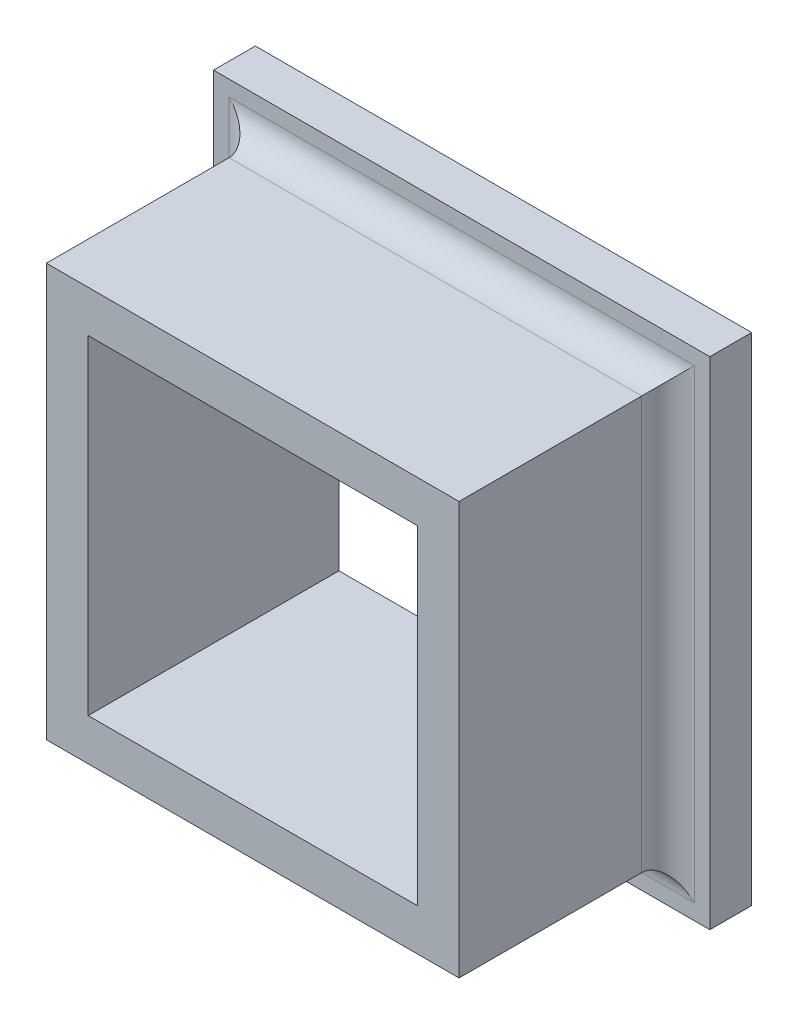
ISO-10303-21;
HEADER;
FILE_DESCRIPTION(('STEP AP214'),'2;1');
FILE_NAME('part.step','',(''),(''),'','','');
FILE_SCHEMA(('AUTOMOTIVE_DESIGN { 1 0 10303 214 1 1 1 1 }'));
ENDSEC;
DATA;
#1=APPLICATION_CONTEXT('core data for automotive mechanical design processes');
#2=APPLICATION_PROTOCOL_DEFINITION('international standard','automotive_design',2000,#1);
#3=PRODUCT_CONTEXT('',#1,'mechanical');
#4=PRODUCT('Part','Part','',(#3));
#5=PRODUCT_RELATED_PRODUCT_CATEGORY('part','',(#4));
#6=PRODUCT_DEFINITION_FORMATION('','',#4);
#7=PRODUCT_DEFINITION_CONTEXT('part definition',#1,'design');
#8=PRODUCT_DEFINITION('design','',#6,#7);
#9=PRODUCT_DEFINITION_SHAPE('','',#8);
#10=(LENGTH_UNIT() NAMED_UNIT(*) SI_UNIT(.MILLI.,.METRE.));
#11=(NAMED_UNIT(*) PLANE_ANGLE_UNIT() SI_UNIT($,.RADIAN.));
#12=(NAMED_UNIT(*) SI_UNIT($,.STERADIAN.) SOLID_ANGLE_UNIT());
#13=UNCERTAINTY_MEASURE_WITH_UNIT(LENGTH_MEASURE(1.E-05),#10,'distance_accuracy_value','');
#14=(GEOMETRIC_REPRESENTATION_CONTEXT(3) GLOBAL_UNCERTAINTY_ASSIGNED_CONTEXT((#13)) GLOBAL_UNIT_ASSIGNED_CONTEXT((#10,
#11,#12)) REPRESENTATION_CONTEXT('',''));
#15=CARTESIAN_POINT('',(0.,0.,0.));
#16=DIRECTION('',(0.,0.,1.));
#17=DIRECTION('',(1.,0.,0.));
#18=AXIS2_PLACEMENT_3D('',#15,#16,#17);
#19=CARTESIAN_POINT('',(0.,7.55340909090909,9.525));
#20=DIRECTION('',(0.,1.,0.));
#21=DIRECTION('',(0.,0.,1.));
#22=AXIS2_PLACEMENT_3D('',#19,#20,#21);
#23=PLANE('',#22);
#24=DIRECTION('',(0.,0.,-1.));
#25=VECTOR('',#24,1.);
#26=CARTESIAN_POINT('',(7.68254132231405,7.55340909090909,9.525));
#27=LINE('',#26,#25);
#28=CARTESIAN_POINT('',(7.68254132231405,7.55340909090909,9.525));
#29=VERTEX_POINT('',#28);
#30=CARTESIAN_POINT('',(7.68254132231405,7.55340909090909,2.5875));
#31=VERTEX_POINT('',#30);
#32=EDGE_CURVE('E218',#29,#31,#27,.T.);
#33=ORIENTED_EDGE('',*,*,#32,.T.);
#34=DIRECTION('',(-1.,0.,0.));
#35=VECTOR('',#34,1.);
#36=CARTESIAN_POINT('',(0.,7.55340909090909,2.5875));
#37=LINE('',#36,#35);
#38=CARTESIAN_POINT('',(-7.99245867768595,7.55340909090909,2.5875));
#39=VERTEX_POINT('',#38);
#40=EDGE_CURVE('E57',#31,#39,#37,.T.);
#41=ORIENTED_EDGE('',*,*,#40,.T.);
#42=DIRECTION('',(0.,0.,-1.));
#43=VECTOR('',#42,1.);
#44=CARTESIAN_POINT('',(-7.99245867768595,7.55340909090909,9.525));
#45=LINE('',#44,#43);
#46=CARTESIAN_POINT('',(-7.99245867768595,7.55340909090909,9.525));
#47=VERTEX_POINT('',#46);
#48=EDGE_CURVE('E225',#47,#39,#45,.T.);
#49=ORIENTED_EDGE('',*,*,#48,.F.);
#50=DIRECTION('',(1.,0.,0.));
#51=VECTOR('',#50,1.);
#52=CARTESIAN_POINT('',(0.,7.55340909090909,9.525));
#53=LINE('',#52,#51);
#54=EDGE_CURVE('E206',#47,#29,#53,.T.);
#55=ORIENTED_EDGE('',*,*,#54,.T.);
#56=EDGE_LOOP('',(#33,#41,#49,#55));
#57=FACE_BOUND('',#56,.T.);
#58=ADVANCED_FACE('F34',(#57),#23,.T.);
#59=CARTESIAN_POINT('',(-7.99245867768595,0.,9.525));
#60=DIRECTION('',(1.,0.,0.));
#61=DIRECTION('',(0.,0.,-1.));
#62=AXIS2_PLACEMENT_3D('',#59,#60,#61);
#63=PLANE('',#62);
#64=ORIENTED_EDGE('',*,*,#48,.T.);
#65=DIRECTION('',(0.,1.,0.));
#66=VECTOR('',#65,1.);
#67=CARTESIAN_POINT('',(-7.99245867768595,-8.12159090909091,2.5875));
#68=LINE('',#67,#66);
#69=CARTESIAN_POINT('',(-7.99245867768595,-8.12159090909091,2.5875));
#70=VERTEX_POINT('',#69);
#71=EDGE_CURVE('E11',#39,#70,#68,.F.);
#72=ORIENTED_EDGE('',*,*,#71,.T.);
#73=DIRECTION('',(0.,0.,-1.));
#74=VECTOR('',#73,1.);
#75=CARTESIAN_POINT('',(-7.99245867768595,-8.12159090909091,9.525));
#76=LINE('',#75,#74);
#77=CARTESIAN_POINT('',(-7.99245867768595,-8.12159090909091,9.525));
#78=VERTEX_POINT('',#77);
#79=EDGE_CURVE('E223',#78,#70,#76,.T.);
#80=ORIENTED_EDGE('',*,*,#79,.F.);
#81=DIRECTION('',(0.,-1.,0.));
#82=VECTOR('',#81,1.);
#83=CARTESIAN_POINT('',(-7.99245867768595,0.,9.525));
#84=LINE('',#83,#82);
#85=EDGE_CURVE('E209',#47,#78,#84,.T.);
#86=ORIENTED_EDGE('',*,*,#85,.F.);
#87=EDGE_LOOP('',(#64,#72,#80,#86));
#88=FACE_BOUND('',#87,.T.);
#89=ADVANCED_FACE('F273',(#88),#63,.F.);
#90=CARTESIAN_POINT('',(0.,-8.12159090909091,9.525));
#91=DIRECTION('',(0.,1.,0.));
#92=DIRECTION('',(0.,0.,1.));
#93=AXIS2_PLACEMENT_3D('',#90,#91,#92);
#94=PLANE('',#93);
#95=ORIENTED_EDGE('',*,*,#79,.T.);
#96=DIRECTION('',(-1.,0.,0.));
#97=VECTOR('',#96,1.);
#98=CARTESIAN_POINT('',(7.68254132231405,-8.12159090909091,2.5875));
#99=LINE('',#98,#97);
#100=CARTESIAN_POINT('',(7.68254132231405,-8.12159090909091,2.5875));
#101=VERTEX_POINT('',#100);
#102=EDGE_CURVE('E43',#70,#101,#99,.F.);
#103=ORIENTED_EDGE('',*,*,#102,.T.);
#104=DIRECTION('',(0.,0.,-1.));
#105=VECTOR('',#104,1.);
#106=CARTESIAN_POINT('',(7.68254132231405,-8.12159090909091,9.525));
#107=LINE('',#106,#105);
#108=CARTESIAN_POINT('',(7.68254132231405,-8.12159090909091,9.525));
#109=VERTEX_POINT('',#108);
#110=EDGE_CURVE('E220',#109,#101,#107,.T.);
#111=ORIENTED_EDGE('',*,*,#110,.F.);
#112=DIRECTION('',(1.,0.,0.));
#113=VECTOR('',#112,1.);
#114=CARTESIAN_POINT('',(0.,-8.12159090909091,9.525));
#115=LINE('',#114,#113);
#116=EDGE_CURVE('E212',#78,#109,#115,.T.);
#117=ORIENTED_EDGE('',*,*,#116,.F.);
#118=EDGE_LOOP('',(#95,#103,#111,#117));
#119=FACE_BOUND('',#118,.T.);
#120=ADVANCED_FACE('F275',(#119),#94,.F.);
#121=CARTESIAN_POINT('',(0.,5.96590909090909,9.525));
#122=DIRECTION('',(0.,1.,0.));
#123=DIRECTION('',(0.,0.,1.));
#124=AXIS2_PLACEMENT_3D('',#121,#122,#123);
#125=PLANE('',#124);
#126=DIRECTION('',(0.,0.,-1.));
#127=VECTOR('',#126,1.);
#128=CARTESIAN_POINT('',(-6.40495867768595,5.96590909090909,9.525));
#129=LINE('',#128,#127);
#130=CARTESIAN_POINT('',(-6.40495867768595,5.96590909090909,9.525));
#131=VERTEX_POINT('',#130);
#132=CARTESIAN_POINT('',(-6.40495867768595,5.96590909090909,0.));
#133=VERTEX_POINT('',#132);
#134=EDGE_CURVE('E217',#131,#133,#129,.T.);
#135=ORIENTED_EDGE('',*,*,#134,.T.);
#136=DIRECTION('',(1.,0.,0.));
#137=VECTOR('',#136,1.);
#138=CARTESIAN_POINT('',(-6.40495867768595,5.96590909090909,0.));
#139=LINE('',#138,#137);
#140=CARTESIAN_POINT('',(6.09504132231405,5.96590909090909,0.));
#141=VERTEX_POINT('',#140);
#142=EDGE_CURVE('E157',#133,#141,#139,.T.);
#143=ORIENTED_EDGE('',*,*,#142,.T.);
#144=DIRECTION('',(0.,0.,-1.));
#145=VECTOR('',#144,1.);
#146=CARTESIAN_POINT('',(6.09504132231405,5.96590909090909,9.525));
#147=LINE('',#146,#145);
#148=CARTESIAN_POINT('',(6.09504132231405,5.96590909090909,9.525));
#149=VERTEX_POINT('',#148);
#150=EDGE_CURVE('E147',#149,#141,#147,.T.);
#151=ORIENTED_EDGE('',*,*,#150,.F.);
#152=DIRECTION('',(1.,0.,0.));
#153=VECTOR('',#152,1.);
#154=CARTESIAN_POINT('',(0.,5.96590909090909,9.525));
#155=LINE('',#154,#153);
#156=EDGE_CURVE('E191',#131,#149,#155,.T.);
#157=ORIENTED_EDGE('',*,*,#156,.F.);
#158=EDGE_LOOP('',(#135,#143,#151,#157));
#159=FACE_BOUND('',#158,.T.);
#160=ADVANCED_FACE('F258',(#159),#125,.F.);
#161=CARTESIAN_POINT('',(6.09504132231405,0.,9.525));
#162=DIRECTION('',(1.,0.,0.));
#163=DIRECTION('',(0.,1.,0.));
#164=AXIS2_PLACEMENT_3D('',#161,#162,#163);
#165=PLANE('',#164);
#166=ORIENTED_EDGE('',*,*,#150,.T.);
#167=DIRECTION('',(0.,-1.,0.));
#168=VECTOR('',#167,1.);
#169=CARTESIAN_POINT('',(6.09504132231405,5.96590909090909,0.));
#170=LINE('',#169,#168);
#171=CARTESIAN_POINT('',(6.09504132231405,-6.53409090909091,0.));
#172=VERTEX_POINT('',#171);
#173=EDGE_CURVE('E151',#141,#172,#170,.T.);
#174=ORIENTED_EDGE('',*,*,#173,.T.);
#175=DIRECTION('',(0.,0.,-1.));
#176=VECTOR('',#175,1.);
#177=CARTESIAN_POINT('',(6.09504132231405,-6.53409090909091,9.525));
#178=LINE('',#177,#176);
#179=CARTESIAN_POINT('',(6.09504132231405,-6.53409090909091,9.525));
#180=VERTEX_POINT('',#179);
#181=EDGE_CURVE('E138',#180,#172,#178,.T.);
#182=ORIENTED_EDGE('',*,*,#181,.F.);
#183=DIRECTION('',(0.,-1.,0.));
#184=VECTOR('',#183,1.);
#185=CARTESIAN_POINT('',(6.09504132231405,0.,9.525));
#186=LINE('',#185,#184);
#187=EDGE_CURVE('E200',#149,#180,#186,.T.);
#188=ORIENTED_EDGE('',*,*,#187,.F.);
#189=EDGE_LOOP('',(#166,#174,#182,#188));
#190=FACE_BOUND('',#189,.T.);
#191=ADVANCED_FACE('F152',(#190),#165,.F.);
#192=CARTESIAN_POINT('',(0.,-6.53409090909091,9.525));
#193=DIRECTION('',(0.,1.,0.));
#194=DIRECTION('',(0.,0.,1.));
#195=AXIS2_PLACEMENT_3D('',#192,#193,#194);
#196=PLANE('',#195);
#197=ORIENTED_EDGE('',*,*,#181,.T.);
#198=DIRECTION('',(1.,0.,0.));
#199=VECTOR('',#198,1.);
#200=CARTESIAN_POINT('',(-6.40495867768595,-6.53409090909091,0.));
#201=LINE('',#200,#199);
#202=CARTESIAN_POINT('',(-6.40495867768595,-6.53409090909091,0.));
#203=VERTEX_POINT('',#202);
#204=EDGE_CURVE('E142',#203,#172,#201,.T.);
#205=ORIENTED_EDGE('',*,*,#204,.F.);
#206=DIRECTION('',(0.,0.,-1.));
#207=VECTOR('',#206,1.);
#208=CARTESIAN_POINT('',(-6.40495867768595,-6.53409090909091,9.525));
#209=LINE('',#208,#207);
#210=CARTESIAN_POINT('',(-6.40495867768595,-6.53409090909091,9.525));
#211=VERTEX_POINT('',#210);
#212=EDGE_CURVE('E148',#211,#203,#209,.T.);
#213=ORIENTED_EDGE('',*,*,#212,.F.);
#214=DIRECTION('',(1.,0.,0.));
#215=VECTOR('',#214,1.);
#216=CARTESIAN_POINT('',(0.,-6.53409090909091,9.525));
#217=LINE('',#216,#215);
#218=EDGE_CURVE('E145',#211,#180,#217,.T.);
#219=ORIENTED_EDGE('',*,*,#218,.T.);
#220=EDGE_LOOP('',(#197,#205,#213,#219));
#221=FACE_BOUND('',#220,.T.);
#222=ADVANCED_FACE('F140',(#221),#196,.T.);
#223=CARTESIAN_POINT('',(-6.40495867768595,0.,9.525));
#224=DIRECTION('',(1.,0.,0.));
#225=DIRECTION('',(0.,1.,0.));
#226=AXIS2_PLACEMENT_3D('',#223,#224,#225);
#227=PLANE('',#226);
#228=ORIENTED_EDGE('',*,*,#212,.T.);
#229=DIRECTION('',(0.,-1.,0.));
#230=VECTOR('',#229,1.);
#231=CARTESIAN_POINT('',(-6.40495867768595,5.96590909090909,0.));
#232=LINE('',#231,#230);
#233=EDGE_CURVE('E162',#133,#203,#232,.T.);
#234=ORIENTED_EDGE('',*,*,#233,.F.);
#235=ORIENTED_EDGE('',*,*,#134,.F.);
#236=DIRECTION('',(0.,-1.,0.));
#237=VECTOR('',#236,1.);
#238=CARTESIAN_POINT('',(-6.40495867768595,0.,9.525));
#239=LINE('',#238,#237);
#240=EDGE_CURVE('E203',#131,#211,#239,.T.);
#241=ORIENTED_EDGE('',*,*,#240,.T.);
#242=EDGE_LOOP('',(#228,#234,#235,#241));
#243=FACE_BOUND('',#242,.T.);
#244=ADVANCED_FACE('F262',(#243),#227,.T.);
#245=CARTESIAN_POINT('',(7.68254132231405,0.,9.525));
#246=DIRECTION('',(1.,0.,0.));
#247=DIRECTION('',(0.,0.,-1.));
#248=AXIS2_PLACEMENT_3D('',#245,#246,#247);
#249=PLANE('',#248);
#250=ORIENTED_EDGE('',*,*,#110,.T.);
#251=DIRECTION('',(0.,1.,0.));
#252=VECTOR('',#251,1.);
#253=CARTESIAN_POINT('',(7.68254132231405,0.,2.5875));
#254=LINE('',#253,#252);
#255=EDGE_CURVE('E227',#101,#31,#254,.T.);
#256=ORIENTED_EDGE('',*,*,#255,.T.);
#257=ORIENTED_EDGE('',*,*,#32,.F.);
#258=DIRECTION('',(0.,-1.,0.));
#259=VECTOR('',#258,1.);
#260=CARTESIAN_POINT('',(7.68254132231405,0.,9.525));
#261=LINE('',#260,#259);
#262=EDGE_CURVE('E214',#29,#109,#261,.T.);
#263=ORIENTED_EDGE('',*,*,#262,.T.);
#264=EDGE_LOOP('',(#250,#256,#257,#263));
#265=FACE_BOUND('',#264,.T.);
#266=ADVANCED_FACE('F268',(#265),#249,.T.);
#267=CARTESIAN_POINT('',(0.,0.,9.525));
#268=DIRECTION('',(0.,0.,1.));
#269=DIRECTION('',(1.,0.,0.));
#270=AXIS2_PLACEMENT_3D('',#267,#268,#269);
#271=PLANE('',#270);
#272=ORIENTED_EDGE('',*,*,#156,.T.);
#273=ORIENTED_EDGE('',*,*,#187,.T.);
#274=ORIENTED_EDGE('',*,*,#218,.F.);
#275=ORIENTED_EDGE('',*,*,#240,.F.);
#276=EDGE_LOOP('',(#272,#273,#274,#275));
#277=FACE_BOUND('',#276,.T.);
#278=ORIENTED_EDGE('',*,*,#54,.F.);
#279=ORIENTED_EDGE('',*,*,#85,.T.);
#280=ORIENTED_EDGE('',*,*,#116,.T.);
#281=ORIENTED_EDGE('',*,*,#262,.F.);
#282=EDGE_LOOP('',(#278,#279,#280,#281));
#283=FACE_BOUND('',#282,.T.);
#284=ADVANCED_FACE('F264',(#277,#283),#271,.T.);
#285=CARTESIAN_POINT('',(0.,0.,1.5875));
#286=DIRECTION('',(0.,0.,-1.));
#287=DIRECTION('',(-1.,0.,0.));
#288=AXIS2_PLACEMENT_3D('',#285,#286,#287);
#289=PLANE('',#288);
#290=DIRECTION('',(-1.,0.,0.));
#291=VECTOR('',#290,1.);
#292=CARTESIAN_POINT('',(0.,8.55340909090909,1.5875));
#293=LINE('',#292,#291);
#294=CARTESIAN_POINT('',(-8.99245867768595,8.55340909090909,1.5875));
#295=VERTEX_POINT('',#294);
#296=CARTESIAN_POINT('',(8.68254132231405,8.55340909090909,1.5875));
#297=VERTEX_POINT('',#296);
#298=EDGE_CURVE('E237',#295,#297,#293,.F.);
#299=ORIENTED_EDGE('',*,*,#298,.T.);
#300=DIRECTION('',(0.,1.,0.));
#301=VECTOR('',#300,1.);
#302=CARTESIAN_POINT('',(8.68254132231405,0.,1.5875));
#303=LINE('',#302,#301);
#304=CARTESIAN_POINT('',(8.68254132231405,-9.12159090909091,1.5875));
#305=VERTEX_POINT('',#304);
#306=EDGE_CURVE('E239',#297,#305,#303,.F.);
#307=ORIENTED_EDGE('',*,*,#306,.T.);
#308=DIRECTION('',(-1.,0.,0.));
#309=VECTOR('',#308,1.);
#310=CARTESIAN_POINT('',(-7.99245867768595,-9.12159090909091,1.5875));
#311=LINE('',#310,#309);
#312=CARTESIAN_POINT('',(-8.99245867768595,-9.12159090909091,1.5875));
#313=VERTEX_POINT('',#312);
#314=EDGE_CURVE('E235',#305,#313,#311,.T.);
#315=ORIENTED_EDGE('',*,*,#314,.T.);
#316=DIRECTION('',(0.,1.,0.));
#317=VECTOR('',#316,1.);
#318=CARTESIAN_POINT('',(-8.99245867768595,7.55340909090909,1.5875));
#319=LINE('',#318,#317);
#320=EDGE_CURVE('E233',#313,#295,#319,.T.);
#321=ORIENTED_EDGE('',*,*,#320,.T.);
#322=EDGE_LOOP('',(#299,#307,#315,#321));
#323=FACE_BOUND('',#322,.T.);
#324=DIRECTION('',(1.,0.,0.));
#325=VECTOR('',#324,1.);
#326=CARTESIAN_POINT('',(-9.57995867768595,9.14090909090909,1.5875));
#327=LINE('',#326,#325);
#328=CARTESIAN_POINT('',(-9.57995867768595,9.14090909090909,1.5875));
#329=VERTEX_POINT('',#328);
#330=CARTESIAN_POINT('',(9.27004132231405,9.14090909090909,1.5875));
#331=VERTEX_POINT('',#330);
#332=EDGE_CURVE('E168',#329,#331,#327,.T.);
#333=ORIENTED_EDGE('',*,*,#332,.F.);
#334=DIRECTION('',(0.,-1.,0.));
#335=VECTOR('',#334,1.);
#336=CARTESIAN_POINT('',(-9.57995867768595,9.14090909090909,1.5875));
#337=LINE('',#336,#335);
#338=CARTESIAN_POINT('',(-9.57995867768595,-9.70909090909091,1.5875));
#339=VERTEX_POINT('',#338);
#340=EDGE_CURVE('E177',#329,#339,#337,.T.);
#341=ORIENTED_EDGE('',*,*,#340,.T.);
#342=DIRECTION('',(1.,0.,0.));
#343=VECTOR('',#342,1.);
#344=CARTESIAN_POINT('',(-9.57995867768595,-9.70909090909091,1.5875));
#345=LINE('',#344,#343);
#346=CARTESIAN_POINT('',(9.27004132231405,-9.70909090909091,1.5875));
#347=VERTEX_POINT('',#346);
#348=EDGE_CURVE('E175',#339,#347,#345,.T.);
#349=ORIENTED_EDGE('',*,*,#348,.T.);
#350=DIRECTION('',(0.,-1.,0.));
#351=VECTOR('',#350,1.);
#352=CARTESIAN_POINT('',(9.27004132231405,9.14090909090909,1.5875));
#353=LINE('',#352,#351);
#354=EDGE_CURVE('E171',#331,#347,#353,.T.);
#355=ORIENTED_EDGE('',*,*,#354,.F.);
#356=EDGE_LOOP('',(#333,#341,#349,#355));
#357=FACE_BOUND('',#356,.T.);
#358=ADVANCED_FACE('F267',(#323,#357),#289,.F.);
#359=CARTESIAN_POINT('',(9.27004132231405,9.14090909090909,1.5875));
#360=DIRECTION('',(1.,0.,0.));
#361=DIRECTION('',(0.,1.,0.));
#362=AXIS2_PLACEMENT_3D('',#359,#360,#361);
#363=PLANE('',#362);
#364=DIRECTION('',(0.,-1.,0.));
#365=VECTOR('',#364,1.);
#366=CARTESIAN_POINT('',(9.27004132231405,9.14090909090909,0.));
#367=LINE('',#366,#365);
#368=CARTESIAN_POINT('',(9.27004132231405,9.14090909090909,0.));
#369=VERTEX_POINT('',#368);
#370=CARTESIAN_POINT('',(9.27004132231405,-9.70909090909091,0.));
#371=VERTEX_POINT('',#370);
#372=EDGE_CURVE('E182',#369,#371,#367,.T.);
#373=ORIENTED_EDGE('',*,*,#372,.F.);
#374=DIRECTION('',(0.,0.,-1.));
#375=VECTOR('',#374,1.);
#376=CARTESIAN_POINT('',(9.27004132231405,9.14090909090909,1.5875));
#377=LINE('',#376,#375);
#378=EDGE_CURVE('E179',#331,#369,#377,.T.);
#379=ORIENTED_EDGE('',*,*,#378,.F.);
#380=ORIENTED_EDGE('',*,*,#354,.T.);
#381=DIRECTION('',(0.,0.,-1.));
#382=VECTOR('',#381,1.);
#383=CARTESIAN_POINT('',(9.27004132231405,-9.70909090909091,1.5875));
#384=LINE('',#383,#382);
#385=EDGE_CURVE('E195',#347,#371,#384,.T.);
#386=ORIENTED_EDGE('',*,*,#385,.T.);
#387=EDGE_LOOP('',(#373,#379,#380,#386));
#388=FACE_BOUND('',#387,.T.);
#389=ADVANCED_FACE('F327',(#388),#363,.T.);
#390=CARTESIAN_POINT('',(-9.57995867768595,-9.70909090909091,1.5875));
#391=DIRECTION('',(0.,1.,0.));
#392=DIRECTION('',(0.,0.,1.));
#393=AXIS2_PLACEMENT_3D('',#390,#391,#392);
#394=PLANE('',#393);
#395=DIRECTION('',(1.,0.,0.));
#396=VECTOR('',#395,1.);
#397=CARTESIAN_POINT('',(-9.57995867768595,-9.70909090909091,0.));
#398=LINE('',#397,#396);
#399=CARTESIAN_POINT('',(-9.57995867768595,-9.70909090909091,0.));
#400=VERTEX_POINT('',#399);
#401=EDGE_CURVE('E185',#400,#371,#398,.T.);
#402=ORIENTED_EDGE('',*,*,#401,.T.);
#403=ORIENTED_EDGE('',*,*,#385,.F.);
#404=ORIENTED_EDGE('',*,*,#348,.F.);
#405=DIRECTION('',(0.,0.,-1.));
#406=VECTOR('',#405,1.);
#407=CARTESIAN_POINT('',(-9.57995867768595,-9.70909090909091,1.5875));
#408=LINE('',#407,#406);
#409=EDGE_CURVE('E192',#339,#400,#408,.T.);
#410=ORIENTED_EDGE('',*,*,#409,.T.);
#411=EDGE_LOOP('',(#402,#403,#404,#410));
#412=FACE_BOUND('',#411,.T.);
#413=ADVANCED_FACE('F330',(#412),#394,.F.);
#414=CARTESIAN_POINT('',(-9.57995867768595,9.14090909090909,1.5875));
#415=DIRECTION('',(1.,0.,0.));
#416=DIRECTION('',(0.,1.,0.));
#417=AXIS2_PLACEMENT_3D('',#414,#415,#416);
#418=PLANE('',#417);
#419=DIRECTION('',(0.,-1.,0.));
#420=VECTOR('',#419,1.);
#421=CARTESIAN_POINT('',(-9.57995867768595,9.14090909090909,0.));
#422=LINE('',#421,#420);
#423=CARTESIAN_POINT('',(-9.57995867768595,9.14090909090909,0.));
#424=VERTEX_POINT('',#423);
#425=EDGE_CURVE('E172',#424,#400,#422,.T.);
#426=ORIENTED_EDGE('',*,*,#425,.T.);
#427=ORIENTED_EDGE('',*,*,#409,.F.);
#428=ORIENTED_EDGE('',*,*,#340,.F.);
#429=DIRECTION('',(0.,0.,-1.));
#430=VECTOR('',#429,1.);
#431=CARTESIAN_POINT('',(-9.57995867768595,9.14090909090909,1.5875));
#432=LINE('',#431,#430);
#433=EDGE_CURVE('E189',#329,#424,#432,.T.);
#434=ORIENTED_EDGE('',*,*,#433,.T.);
#435=EDGE_LOOP('',(#426,#427,#428,#434));
#436=FACE_BOUND('',#435,.T.);
#437=ADVANCED_FACE('F323',(#436),#418,.F.);
#438=CARTESIAN_POINT('',(-9.57995867768595,9.14090909090909,1.5875));
#439=DIRECTION('',(0.,1.,0.));
#440=DIRECTION('',(0.,0.,1.));
#441=AXIS2_PLACEMENT_3D('',#438,#439,#440);
#442=PLANE('',#441);
#443=DIRECTION('',(1.,0.,0.));
#444=VECTOR('',#443,1.);
#445=CARTESIAN_POINT('',(-9.57995867768595,9.14090909090909,0.));
#446=LINE('',#445,#444);
#447=EDGE_CURVE('E164',#424,#369,#446,.T.);
#448=ORIENTED_EDGE('',*,*,#447,.F.);
#449=ORIENTED_EDGE('',*,*,#433,.F.);
#450=ORIENTED_EDGE('',*,*,#332,.T.);
#451=ORIENTED_EDGE('',*,*,#378,.T.);
#452=EDGE_LOOP('',(#448,#449,#450,#451));
#453=FACE_BOUND('',#452,.T.);
#454=ADVANCED_FACE('F319',(#453),#442,.T.);
#455=CARTESIAN_POINT('',(0.,0.,0.));
#456=DIRECTION('',(0.,0.,1.));
#457=DIRECTION('',(1.,0.,0.));
#458=AXIS2_PLACEMENT_3D('',#455,#456,#457);
#459=PLANE('',#458);
#460=ORIENTED_EDGE('',*,*,#173,.F.);
#461=ORIENTED_EDGE('',*,*,#142,.F.);
#462=ORIENTED_EDGE('',*,*,#233,.T.);
#463=ORIENTED_EDGE('',*,*,#204,.T.);
#464=EDGE_LOOP('',(#460,#461,#462,#463));
#465=FACE_BOUND('',#464,.T.);
#466=ORIENTED_EDGE('',*,*,#447,.T.);
#467=ORIENTED_EDGE('',*,*,#372,.T.);
#468=ORIENTED_EDGE('',*,*,#401,.F.);
#469=ORIENTED_EDGE('',*,*,#425,.F.);
#470=EDGE_LOOP('',(#466,#467,#468,#469));
#471=FACE_BOUND('',#470,.T.);
#472=ADVANCED_FACE('F159',(#465,#471),#459,.F.);
#473=CARTESIAN_POINT('',(-8.99245867768595,0.,2.5875));
#474=DIRECTION('',(0.,-1.,0.));
#475=DIRECTION('',(0.,0.,-1.));
#476=AXIS2_PLACEMENT_3D('',#473,#474,#475);
#477=CYLINDRICAL_SURFACE('',#476,1.);
#478=CARTESIAN_POINT('',(-8.99245867768595,8.55340909090909,2.5875));
#479=DIRECTION('',(-0.707106781186547,-0.707106781186547,0.));
#480=DIRECTION('',(0.707106781186547,-0.707106781186547,0.));
#481=AXIS2_PLACEMENT_3D('',#478,#479,#480);
#482=ELLIPSE('',#481,1.41421356237309,1.);
#483=EDGE_CURVE('E247',#295,#39,#482,.T.);
#484=ORIENTED_EDGE('',*,*,#483,.F.);
#485=ORIENTED_EDGE('',*,*,#320,.F.);
#486=CARTESIAN_POINT('',(-8.99245867768595,-9.12159090909091,2.5875));
#487=DIRECTION('',(0.707106781186547,-0.707106781186547,0.));
#488=DIRECTION('',(-0.707106781186547,-0.707106781186547,0.));
#489=AXIS2_PLACEMENT_3D('',#486,#487,#488);
#490=ELLIPSE('',#489,1.41421356237309,1.);
#491=EDGE_CURVE('E38',#70,#313,#490,.F.);
#492=ORIENTED_EDGE('',*,*,#491,.F.);
#493=ORIENTED_EDGE('',*,*,#71,.F.);
#494=EDGE_LOOP('',(#484,#485,#492,#493));
#495=FACE_BOUND('',#494,.T.);
#496=ADVANCED_FACE('F36',(#495),#477,.F.);
#497=CARTESIAN_POINT('',(0.,-9.12159090909091,2.5875));
#498=DIRECTION('',(1.,0.,0.));
#499=DIRECTION('',(0.,0.,-1.));
#500=AXIS2_PLACEMENT_3D('',#497,#498,#499);
#501=CYLINDRICAL_SURFACE('',#500,1.);
#502=ORIENTED_EDGE('',*,*,#491,.T.);
#503=ORIENTED_EDGE('',*,*,#314,.F.);
#504=CARTESIAN_POINT('',(8.68254132231405,-9.12159090909091,2.5875));
#505=DIRECTION('',(0.707106781186547,0.707106781186547,0.));
#506=DIRECTION('',(0.707106781186547,-0.707106781186547,0.));
#507=AXIS2_PLACEMENT_3D('',#504,#505,#506);
#508=ELLIPSE('',#507,1.41421356237309,1.);
#509=EDGE_CURVE('E246',#101,#305,#508,.F.);
#510=ORIENTED_EDGE('',*,*,#509,.F.);
#511=ORIENTED_EDGE('',*,*,#102,.F.);
#512=EDGE_LOOP('',(#502,#503,#510,#511));
#513=FACE_BOUND('',#512,.T.);
#514=ADVANCED_FACE('F280',(#513),#501,.F.);
#515=CARTESIAN_POINT('',(0.,8.55340909090909,2.5875));
#516=DIRECTION('',(-1.,0.,0.));
#517=DIRECTION('',(0.,0.,1.));
#518=AXIS2_PLACEMENT_3D('',#515,#516,#517);
#519=CYLINDRICAL_SURFACE('',#518,1.);
#520=ORIENTED_EDGE('',*,*,#483,.T.);
#521=ORIENTED_EDGE('',*,*,#40,.F.);
#522=CARTESIAN_POINT('',(8.68254132231405,8.55340909090909,2.5875));
#523=DIRECTION('',(-0.707106781186547,0.707106781186547,0.));
#524=DIRECTION('',(-0.707106781186547,-0.707106781186547,0.));
#525=AXIS2_PLACEMENT_3D('',#522,#523,#524);
#526=ELLIPSE('',#525,1.41421356237309,1.);
#527=EDGE_CURVE('E244',#297,#31,#526,.T.);
#528=ORIENTED_EDGE('',*,*,#527,.F.);
#529=ORIENTED_EDGE('',*,*,#298,.F.);
#530=EDGE_LOOP('',(#520,#521,#528,#529));
#531=FACE_BOUND('',#530,.T.);
#532=ADVANCED_FACE('F310',(#531),#519,.F.);
#533=CARTESIAN_POINT('',(8.68254132231405,0.,2.5875));
#534=DIRECTION('',(0.,1.,0.));
#535=DIRECTION('',(0.,0.,1.));
#536=AXIS2_PLACEMENT_3D('',#533,#534,#535);
#537=CYLINDRICAL_SURFACE('',#536,1.);
#538=ORIENTED_EDGE('',*,*,#509,.T.);
#539=ORIENTED_EDGE('',*,*,#306,.F.);
#540=ORIENTED_EDGE('',*,*,#527,.T.);
#541=ORIENTED_EDGE('',*,*,#255,.F.);
#542=EDGE_LOOP('',(#538,#539,#540,#541));
#543=FACE_BOUND('',#542,.T.);
#544=ADVANCED_FACE('F284',(#543),#537,.F.);
#545=CLOSED_SHELL('',(#58,#89,#120,#160,#191,#222,#244,#266,#284,#358,#389,#413,#437,#454,#472,
#496,#514,#532,#544));
#546=MANIFOLD_SOLID_BREP('B2',#545);
#547=ADVANCED_BREP_SHAPE_REPRESENTATION('',(#18,#546),#14);
#548=SHAPE_DEFINITION_REPRESENTATION(#9,#547);
ENDSEC;
END-ISO-10303-21;
